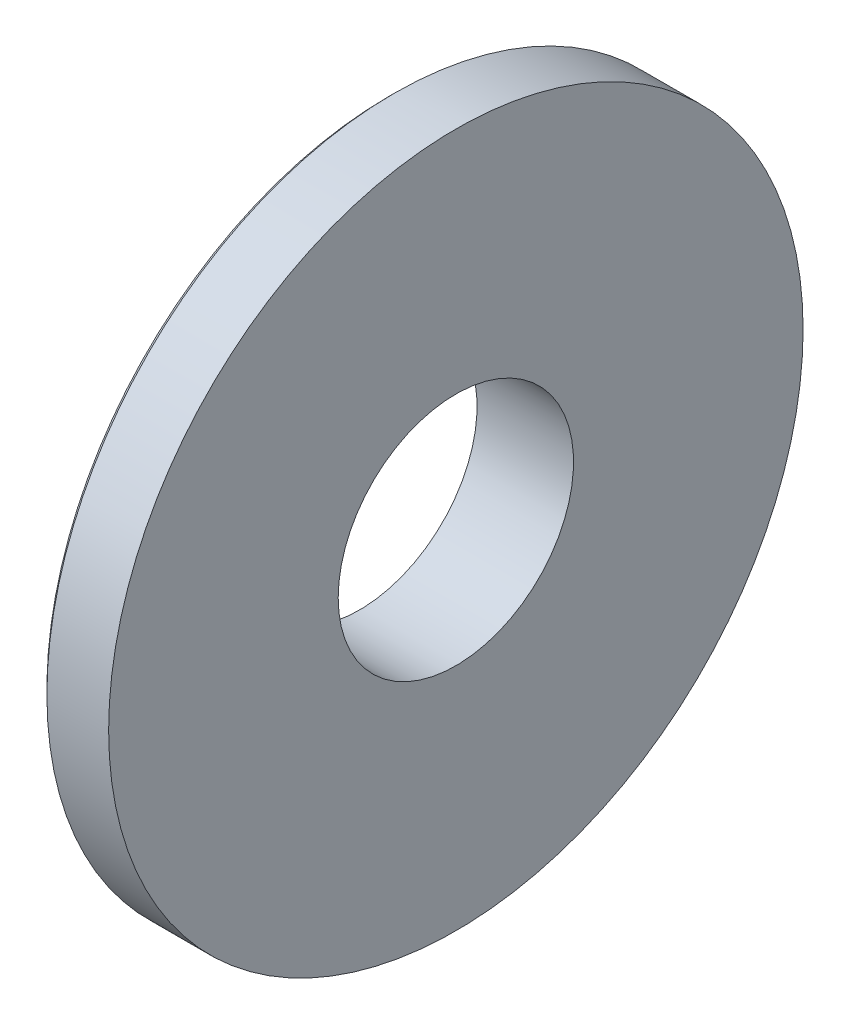
ISO-10303-21;
HEADER;
FILE_DESCRIPTION(('STEP AP214'),'2;1');
FILE_NAME('part.step','',(''),(''),'','','');
FILE_SCHEMA(('AUTOMOTIVE_DESIGN { 1 0 10303 214 1 1 1 1 }'));
ENDSEC;
DATA;
#1=APPLICATION_CONTEXT('core data for automotive mechanical design processes');
#2=APPLICATION_PROTOCOL_DEFINITION('international standard','automotive_design',2000,#1);
#3=PRODUCT_CONTEXT('',#1,'mechanical');
#4=PRODUCT('Part','Part','',(#3));
#5=PRODUCT_RELATED_PRODUCT_CATEGORY('part','',(#4));
#6=PRODUCT_DEFINITION_FORMATION('','',#4);
#7=PRODUCT_DEFINITION_CONTEXT('part definition',#1,'design');
#8=PRODUCT_DEFINITION('design','',#6,#7);
#9=PRODUCT_DEFINITION_SHAPE('','',#8);
#10=(LENGTH_UNIT() NAMED_UNIT(*) SI_UNIT(.MILLI.,.METRE.));
#11=(NAMED_UNIT(*) PLANE_ANGLE_UNIT() SI_UNIT($,.RADIAN.));
#12=(NAMED_UNIT(*) SI_UNIT($,.STERADIAN.) SOLID_ANGLE_UNIT());
#13=UNCERTAINTY_MEASURE_WITH_UNIT(LENGTH_MEASURE(1.E-05),#10,'distance_accuracy_value','');
#14=(GEOMETRIC_REPRESENTATION_CONTEXT(3) GLOBAL_UNCERTAINTY_ASSIGNED_CONTEXT((#13)) GLOBAL_UNIT_ASSIGNED_CONTEXT((#10,
#11,#12)) REPRESENTATION_CONTEXT('',''));
#15=CARTESIAN_POINT('',(0.,0.,0.));
#16=DIRECTION('',(0.,0.,1.));
#17=DIRECTION('',(1.,0.,0.));
#18=AXIS2_PLACEMENT_3D('',#15,#16,#17);
#19=CARTESIAN_POINT('',(0.77037037037037,0.,0.));
#20=DIRECTION('',(1.,0.,0.));
#21=DIRECTION('',(0.,1.,0.));
#22=AXIS2_PLACEMENT_3D('',#19,#20,#21);
#23=CONICAL_SURFACE('',#22,8.87037037037037,1.34608515838025);
#24=CARTESIAN_POINT('',(0.,0.,0.));
#25=DIRECTION('',(1.,0.,0.));
#26=DIRECTION('',(0.,1.,0.));
#27=AXIS2_PLACEMENT_3D('',#24,#25,#26);
#28=CIRCLE('',#27,5.5);
#29=CARTESIAN_POINT('',(0.,5.5,0.));
#30=VERTEX_POINT('',#29);
#31=EDGE_CURVE('E17',#30,#30,#28,.T.);
#32=ORIENTED_EDGE('',*,*,#31,.T.);
#33=EDGE_LOOP('',(#32));
#34=FACE_BOUND('',#33,.T.);
#35=CARTESIAN_POINT('',(0.770370370370373,0.,0.));
#36=DIRECTION('',(1.,0.,0.));
#37=DIRECTION('',(0.,0.,-1.));
#38=AXIS2_PLACEMENT_3D('',#35,#36,#37);
#39=CIRCLE('',#38,8.87037037037037);
#40=CARTESIAN_POINT('',(0.770370370370373,0.,-8.87037037037037));
#41=VERTEX_POINT('',#40);
#42=EDGE_CURVE('E29',#41,#41,#39,.T.);
#43=ORIENTED_EDGE('',*,*,#42,.F.);
#44=EDGE_LOOP('',(#43));
#45=FACE_BOUND('',#44,.T.);
#46=ADVANCED_FACE('F14',(#34,#45),#23,.T.);
#47=CARTESIAN_POINT('',(0.900000000000006,0.,0.));
#48=DIRECTION('',(1.,0.,0.));
#49=DIRECTION('',(0.,1.,0.));
#50=AXIS2_PLACEMENT_3D('',#47,#48,#49);
#51=CONICAL_SURFACE('',#50,9.,0.785398163397445);
#52=CARTESIAN_POINT('',(0.900000000000006,0.,0.));
#53=DIRECTION('',(-1.,0.,0.));
#54=DIRECTION('',(0.,0.,1.));
#55=AXIS2_PLACEMENT_3D('',#52,#53,#54);
#56=CIRCLE('',#55,9.);
#57=CARTESIAN_POINT('',(0.900000000000006,0.,9.));
#58=VERTEX_POINT('',#57);
#59=EDGE_CURVE('E32',#58,#58,#56,.F.);
#60=ORIENTED_EDGE('',*,*,#59,.F.);
#61=EDGE_LOOP('',(#60));
#62=FACE_BOUND('',#61,.T.);
#63=ORIENTED_EDGE('',*,*,#42,.T.);
#64=EDGE_LOOP('',(#63));
#65=FACE_BOUND('',#64,.T.);
#66=ADVANCED_FACE('F44',(#62,#65),#51,.T.);
#67=CARTESIAN_POINT('',(0.,0.,-3.05));
#68=DIRECTION('',(1.,0.,0.));
#69=DIRECTION('',(0.,0.,-1.));
#70=AXIS2_PLACEMENT_3D('',#67,#68,#69);
#71=PLANE('',#70);
#72=ORIENTED_EDGE('',*,*,#31,.F.);
#73=EDGE_LOOP('',(#72));
#74=FACE_BOUND('',#73,.T.);
#75=CARTESIAN_POINT('',(0.,0.,0.));
#76=DIRECTION('',(-1.,0.,0.));
#77=DIRECTION('',(0.,0.,1.));
#78=AXIS2_PLACEMENT_3D('',#75,#76,#77);
#79=CIRCLE('',#78,3.05);
#80=CARTESIAN_POINT('',(0.,0.,3.05));
#81=VERTEX_POINT('',#80);
#82=EDGE_CURVE('E26',#81,#81,#79,.F.);
#83=ORIENTED_EDGE('',*,*,#82,.T.);
#84=EDGE_LOOP('',(#83));
#85=FACE_BOUND('',#84,.T.);
#86=ADVANCED_FACE('F51',(#74,#85),#71,.F.);
#87=CARTESIAN_POINT('',(0.,0.,0.));
#88=DIRECTION('',(-1.,0.,0.));
#89=DIRECTION('',(0.,0.,1.));
#90=AXIS2_PLACEMENT_3D('',#87,#88,#89);
#91=CYLINDRICAL_SURFACE('',#90,9.);
#92=ORIENTED_EDGE('',*,*,#59,.T.);
#93=EDGE_LOOP('',(#92));
#94=FACE_BOUND('',#93,.T.);
#95=CARTESIAN_POINT('',(2.5,0.,0.));
#96=DIRECTION('',(-1.,0.,0.));
#97=DIRECTION('',(0.,0.,1.));
#98=AXIS2_PLACEMENT_3D('',#95,#96,#97);
#99=CIRCLE('',#98,9.);
#100=CARTESIAN_POINT('',(2.5,0.,9.));
#101=VERTEX_POINT('',#100);
#102=EDGE_CURVE('E21',#101,#101,#99,.T.);
#103=ORIENTED_EDGE('',*,*,#102,.T.);
#104=EDGE_LOOP('',(#103));
#105=FACE_BOUND('',#104,.T.);
#106=ADVANCED_FACE('F61',(#94,#105),#91,.T.);
#107=CARTESIAN_POINT('',(0.,0.,0.));
#108=DIRECTION('',(-1.,0.,0.));
#109=DIRECTION('',(0.,0.,1.));
#110=AXIS2_PLACEMENT_3D('',#107,#108,#109);
#111=CYLINDRICAL_SURFACE('',#110,3.05);
#112=CARTESIAN_POINT('',(2.5,0.,0.));
#113=DIRECTION('',(-1.,0.,0.));
#114=DIRECTION('',(0.,0.,1.));
#115=AXIS2_PLACEMENT_3D('',#112,#113,#114);
#116=CIRCLE('',#115,3.05);
#117=CARTESIAN_POINT('',(2.5,0.,3.05));
#118=VERTEX_POINT('',#117);
#119=EDGE_CURVE('E10',#118,#118,#116,.F.);
#120=ORIENTED_EDGE('',*,*,#119,.T.);
#121=EDGE_LOOP('',(#120));
#122=FACE_BOUND('',#121,.T.);
#123=ORIENTED_EDGE('',*,*,#82,.F.);
#124=EDGE_LOOP('',(#123));
#125=FACE_BOUND('',#124,.T.);
#126=ADVANCED_FACE('F55',(#122,#125),#111,.F.);
#127=CARTESIAN_POINT('',(2.5,0.,-3.05));
#128=DIRECTION('',(-1.,0.,0.));
#129=DIRECTION('',(0.,0.,1.));
#130=AXIS2_PLACEMENT_3D('',#127,#128,#129);
#131=PLANE('',#130);
#132=ORIENTED_EDGE('',*,*,#119,.F.);
#133=EDGE_LOOP('',(#132));
#134=FACE_BOUND('',#133,.T.);
#135=ORIENTED_EDGE('',*,*,#102,.F.);
#136=EDGE_LOOP('',(#135));
#137=FACE_BOUND('',#136,.T.);
#138=ADVANCED_FACE('F53',(#134,#137),#131,.F.);
#139=CLOSED_SHELL('',(#46,#66,#86,#106,#126,#138));
#140=MANIFOLD_SOLID_BREP('B1',#139);
#141=ADVANCED_BREP_SHAPE_REPRESENTATION('',(#18,#140),#14);
#142=SHAPE_DEFINITION_REPRESENTATION(#9,#141);
ENDSEC;
END-ISO-10303-21;
